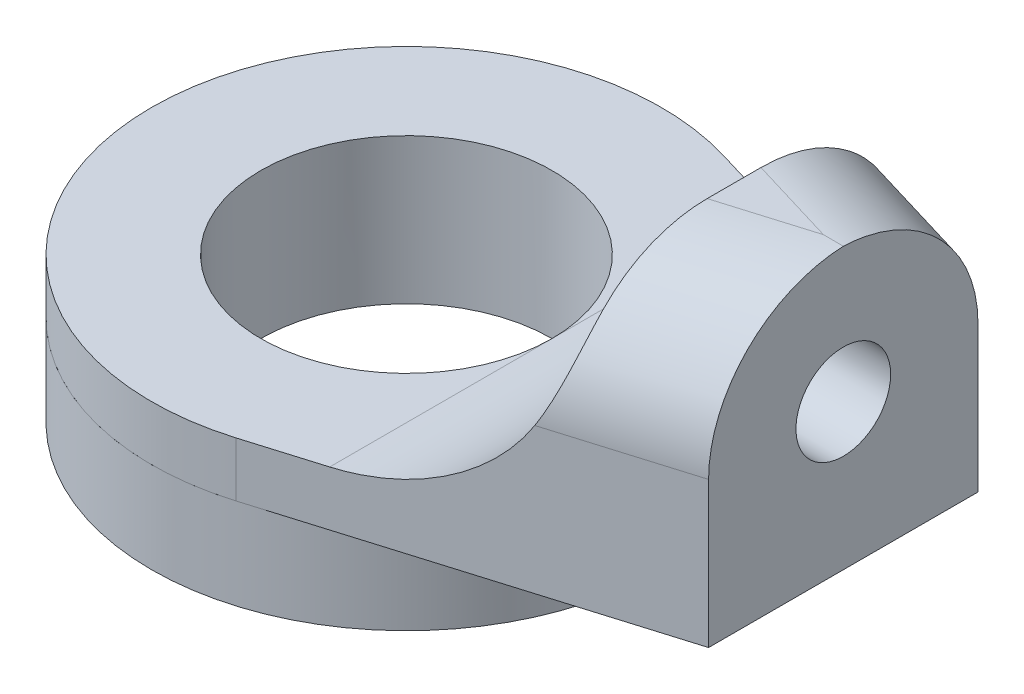
ISO-10303-21;
HEADER;
FILE_DESCRIPTION(('STEP AP214'),'2;1');
FILE_NAME('part.step','',(''),(''),'','','');
FILE_SCHEMA(('AUTOMOTIVE_DESIGN { 1 0 10303 214 1 1 1 1 }'));
ENDSEC;
DATA;
#1=APPLICATION_CONTEXT('core data for automotive mechanical design processes');
#2=APPLICATION_PROTOCOL_DEFINITION('international standard','automotive_design',2000,#1);
#3=PRODUCT_CONTEXT('',#1,'mechanical');
#4=PRODUCT('Part','Part','',(#3));
#5=PRODUCT_RELATED_PRODUCT_CATEGORY('part','',(#4));
#6=PRODUCT_DEFINITION_FORMATION('','',#4);
#7=PRODUCT_DEFINITION_CONTEXT('part definition',#1,'design');
#8=PRODUCT_DEFINITION('design','',#6,#7);
#9=PRODUCT_DEFINITION_SHAPE('','',#8);
#10=(LENGTH_UNIT() NAMED_UNIT(*) SI_UNIT(.MILLI.,.METRE.));
#11=(NAMED_UNIT(*) PLANE_ANGLE_UNIT() SI_UNIT($,.RADIAN.));
#12=(NAMED_UNIT(*) SI_UNIT($,.STERADIAN.) SOLID_ANGLE_UNIT());
#13=UNCERTAINTY_MEASURE_WITH_UNIT(LENGTH_MEASURE(1.E-05),#10,'distance_accuracy_value','');
#14=(GEOMETRIC_REPRESENTATION_CONTEXT(3) GLOBAL_UNCERTAINTY_ASSIGNED_CONTEXT((#13)) GLOBAL_UNIT_ASSIGNED_CONTEXT((#10,
#11,#12)) REPRESENTATION_CONTEXT('',''));
#15=CARTESIAN_POINT('',(0.,0.,0.));
#16=DIRECTION('',(0.,0.,1.));
#17=DIRECTION('',(1.,0.,0.));
#18=AXIS2_PLACEMENT_3D('',#15,#16,#17);
#19=CARTESIAN_POINT('',(0.,1.5,0.));
#20=DIRECTION('',(0.,1.,0.));
#21=DIRECTION('',(0.,0.,1.));
#22=AXIS2_PLACEMENT_3D('',#19,#20,#21);
#23=PLANE('',#22);
#24=DIRECTION('',(-0.957591785777704,0.,0.288128394662984));
#25=VECTOR('',#24,1.);
#26=CARTESIAN_POINT('',(2.01708038245361,1.5,6.70374611204213));
#27=LINE('',#26,#25);
#28=CARTESIAN_POINT('',(4.,1.5,6.10710832270962));
#29=VERTEX_POINT('',#28);
#30=CARTESIAN_POINT('',(2.01708038245361,1.5,6.70374611204213));
#31=VERTEX_POINT('',#30);
#32=EDGE_CURVE('E141',#29,#31,#27,.T.);
#33=ORIENTED_EDGE('',*,*,#32,.F.);
#34=DIRECTION('',(0.,0.,-1.));
#35=VECTOR('',#34,1.);
#36=CARTESIAN_POINT('',(4.,1.5,-4.60266562101611));
#37=LINE('',#36,#35);
#38=CARTESIAN_POINT('',(4.,1.5,0.));
#39=VERTEX_POINT('',#38);
#40=EDGE_CURVE('E159',#29,#39,#37,.T.);
#41=ORIENTED_EDGE('',*,*,#40,.T.);
#42=CARTESIAN_POINT('',(0.,1.5,0.));
#43=DIRECTION('',(0.,1.,0.));
#44=DIRECTION('',(0.,0.,1.));
#45=AXIS2_PLACEMENT_3D('',#42,#43,#44);
#46=CIRCLE('',#45,4.);
#47=EDGE_CURVE('E382',#39,#39,#46,.T.);
#48=ORIENTED_EDGE('',*,*,#47,.F.);
#49=DIRECTION('',(0.,0.,-1.));
#50=VECTOR('',#49,1.);
#51=CARTESIAN_POINT('',(4.,1.5,-4.60266562101611));
#52=LINE('',#51,#50);
#53=CARTESIAN_POINT('',(4.,1.5,-6.10710832270962));
#54=VERTEX_POINT('',#53);
#55=EDGE_CURVE('E157',#39,#54,#52,.T.);
#56=ORIENTED_EDGE('',*,*,#55,.T.);
#57=DIRECTION('',(-0.957591785777704,0.,-0.288128394662984));
#58=VECTOR('',#57,1.);
#59=CARTESIAN_POINT('',(2.01708038245361,1.5,-6.70374611204213));
#60=LINE('',#59,#58);
#61=CARTESIAN_POINT('',(2.01708038245361,1.5,-6.70374611204213));
#62=VERTEX_POINT('',#61);
#63=EDGE_CURVE('E154',#54,#62,#60,.T.);
#64=ORIENTED_EDGE('',*,*,#63,.T.);
#65=CARTESIAN_POINT('',(0.,1.5,0.));
#66=DIRECTION('',(0.,1.,0.));
#67=DIRECTION('',(0.,0.,1.));
#68=AXIS2_PLACEMENT_3D('',#65,#66,#67);
#69=CIRCLE('',#68,7.00063034333332);
#70=EDGE_CURVE('E120',#62,#31,#69,.T.);
#71=ORIENTED_EDGE('',*,*,#70,.T.);
#72=EDGE_LOOP('',(#33,#41,#48,#56,#64,#71));
#73=FACE_BOUND('',#72,.T.);
#74=ADVANCED_FACE('F40',(#73),#23,.T.);
#75=CARTESIAN_POINT('',(0.,0.,0.));
#76=DIRECTION('',(0.,1.,0.));
#77=DIRECTION('',(0.,0.,1.));
#78=AXIS2_PLACEMENT_3D('',#75,#76,#77);
#79=PLANE('',#78);
#80=DIRECTION('',(-0.957591785777704,0.,-0.288128394662984));
#81=VECTOR('',#80,1.);
#82=CARTESIAN_POINT('',(2.01708038245361,0.,-6.70374611204213));
#83=LINE('',#82,#81);
#84=CARTESIAN_POINT('',(12.,0.,-3.7));
#85=VERTEX_POINT('',#84);
#86=CARTESIAN_POINT('',(2.01708038245361,0.,-6.70374611204213));
#87=VERTEX_POINT('',#86);
#88=EDGE_CURVE('E132',#85,#87,#83,.T.);
#89=ORIENTED_EDGE('',*,*,#88,.F.);
#90=DIRECTION('',(0.,0.,-1.));
#91=VECTOR('',#90,1.);
#92=CARTESIAN_POINT('',(12.,0.,0.));
#93=LINE('',#92,#91);
#94=CARTESIAN_POINT('',(12.,0.,3.7));
#95=VERTEX_POINT('',#94);
#96=EDGE_CURVE('E125',#95,#85,#93,.T.);
#97=ORIENTED_EDGE('',*,*,#96,.F.);
#98=DIRECTION('',(-0.957591785777704,0.,0.288128394662984));
#99=VECTOR('',#98,1.);
#100=CARTESIAN_POINT('',(2.01708038245361,0.,6.70374611204213));
#101=LINE('',#100,#99);
#102=CARTESIAN_POINT('',(2.01708038245361,0.,6.70374611204213));
#103=VERTEX_POINT('',#102);
#104=EDGE_CURVE('E135',#95,#103,#101,.T.);
#105=ORIENTED_EDGE('',*,*,#104,.T.);
#106=CARTESIAN_POINT('',(0.,0.,0.));
#107=DIRECTION('',(0.,1.,0.));
#108=DIRECTION('',(0.,0.,1.));
#109=AXIS2_PLACEMENT_3D('',#106,#107,#108);
#110=CIRCLE('',#109,7.00063034333332);
#111=EDGE_CURVE('E118',#87,#103,#110,.T.);
#112=ORIENTED_EDGE('',*,*,#111,.F.);
#113=EDGE_LOOP('',(#89,#97,#105,#112));
#114=FACE_BOUND('',#113,.T.);
#115=CARTESIAN_POINT('',(0.,0.,0.));
#116=DIRECTION('',(0.,1.,0.));
#117=DIRECTION('',(0.,0.,1.));
#118=AXIS2_PLACEMENT_3D('',#115,#116,#117);
#119=CIRCLE('',#118,7.);
#120=CARTESIAN_POINT('',(0.,0.,7.));
#121=VERTEX_POINT('',#120);
#122=EDGE_CURVE('E160',#121,#121,#119,.F.);
#123=ORIENTED_EDGE('',*,*,#122,.F.);
#124=EDGE_LOOP('',(#123));
#125=FACE_BOUND('',#124,.T.);
#126=ADVANCED_FACE('F129',(#114,#125),#79,.F.);
#127=CARTESIAN_POINT('',(0.,0.,0.));
#128=DIRECTION('',(0.,1.,0.));
#129=DIRECTION('',(0.,0.,1.));
#130=AXIS2_PLACEMENT_3D('',#127,#128,#129);
#131=CYLINDRICAL_SURFACE('',#130,4.);
#132=ORIENTED_EDGE('',*,*,#47,.T.);
#133=EDGE_LOOP('',(#132));
#134=FACE_BOUND('',#133,.T.);
#135=CARTESIAN_POINT('',(0.,-2.5,0.));
#136=DIRECTION('',(0.,-1.,0.));
#137=DIRECTION('',(0.,0.,-1.));
#138=AXIS2_PLACEMENT_3D('',#135,#136,#137);
#139=CIRCLE('',#138,4.);
#140=CARTESIAN_POINT('',(0.,-2.5,-4.));
#141=VERTEX_POINT('',#140);
#142=EDGE_CURVE('E396',#141,#141,#139,.T.);
#143=ORIENTED_EDGE('',*,*,#142,.T.);
#144=EDGE_LOOP('',(#143));
#145=FACE_BOUND('',#144,.T.);
#146=ADVANCED_FACE('F217',(#134,#145),#131,.F.);
#147=CARTESIAN_POINT('',(2.01708038245361,0.,-6.70374611204213));
#148=DIRECTION('',(0.288128394662984,0.,-0.957591785777704));
#149=DIRECTION('',(-0.957591785777704,0.,-0.288128394662984));
#150=AXIS2_PLACEMENT_3D('',#147,#148,#149);
#151=PLANE('',#150);
#152=CARTESIAN_POINT('',(4.,6.5,-6.10710832270962));
#153=DIRECTION('',(0.288128394662984,0.,-0.957591785777704));
#154=DIRECTION('',(0.957591785777704,0.,0.288128394662984));
#155=AXIS2_PLACEMENT_3D('',#152,#153,#154);
#156=ELLIPSE('',#155,5.22143158938991,5.);
#157=CARTESIAN_POINT('',(8.3301270189222,4.,-4.80422272450494));
#158=VERTEX_POINT('',#157);
#159=EDGE_CURVE('E166',#54,#158,#156,.F.);
#160=ORIENTED_EDGE('',*,*,#159,.T.);
#161=DIRECTION('',(-0.957591785777704,0.,-0.288128394662984));
#162=VECTOR('',#161,1.);
#163=CARTESIAN_POINT('',(2.01708038245361,4.,-6.70374611204213));
#164=LINE('',#163,#162);
#165=CARTESIAN_POINT('',(12.,4.,-3.7));
#166=VERTEX_POINT('',#165);
#167=EDGE_CURVE('E371',#158,#166,#164,.F.);
#168=ORIENTED_EDGE('',*,*,#167,.T.);
#169=DIRECTION('',(0.,1.,0.));
#170=VECTOR('',#169,1.);
#171=CARTESIAN_POINT('',(12.,0.,-3.7));
#172=LINE('',#171,#170);
#173=EDGE_CURVE('E140',#85,#166,#172,.T.);
#174=ORIENTED_EDGE('',*,*,#173,.F.);
#175=ORIENTED_EDGE('',*,*,#88,.T.);
#176=DIRECTION('',(0.,1.,0.));
#177=VECTOR('',#176,1.);
#178=CARTESIAN_POINT('',(2.01708038245361,0.,-6.70374611204213));
#179=LINE('',#178,#177);
#180=EDGE_CURVE('E114',#87,#62,#179,.T.);
#181=ORIENTED_EDGE('',*,*,#180,.T.);
#182=ORIENTED_EDGE('',*,*,#63,.F.);
#183=EDGE_LOOP('',(#160,#168,#174,#175,#181,#182));
#184=FACE_BOUND('',#183,.T.);
#185=ADVANCED_FACE('F139',(#184),#151,.T.);
#186=CARTESIAN_POINT('',(12.,0.,0.));
#187=DIRECTION('',(1.,0.,0.));
#188=DIRECTION('',(0.,0.,-1.));
#189=AXIS2_PLACEMENT_3D('',#186,#187,#188);
#190=PLANE('',#189);
#191=CARTESIAN_POINT('',(12.,4.,0.));
#192=DIRECTION('',(1.,0.,0.));
#193=DIRECTION('',(0.,0.,-1.));
#194=AXIS2_PLACEMENT_3D('',#191,#192,#193);
#195=CIRCLE('',#194,1.3);
#196=CARTESIAN_POINT('',(12.,4.,-1.3));
#197=VERTEX_POINT('',#196);
#198=EDGE_CURVE('E179',#197,#197,#195,.T.);
#199=ORIENTED_EDGE('',*,*,#198,.F.);
#200=EDGE_LOOP('',(#199));
#201=FACE_BOUND('',#200,.T.);
#202=ORIENTED_EDGE('',*,*,#173,.T.);
#203=CARTESIAN_POINT('',(12.,4.,0.163859376148534));
#204=DIRECTION('',(1.,0.,0.));
#205=DIRECTION('',(0.,0.,-1.));
#206=AXIS2_PLACEMENT_3D('',#203,#204,#205);
#207=ELLIPSE('',#206,3.86385937614854,3.7);
#208=CARTESIAN_POINT('',(12.,7.69667135794989,0.));
#209=VERTEX_POINT('',#208);
#210=EDGE_CURVE('E50',#166,#209,#207,.T.);
#211=ORIENTED_EDGE('',*,*,#210,.T.);
#212=CARTESIAN_POINT('',(12.,4.,-0.163859376148534));
#213=DIRECTION('',(1.,0.,0.));
#214=DIRECTION('',(0.,0.,1.));
#215=AXIS2_PLACEMENT_3D('',#212,#213,#214);
#216=ELLIPSE('',#215,3.86385937614854,3.7);
#217=CARTESIAN_POINT('',(12.,4.,3.7));
#218=VERTEX_POINT('',#217);
#219=EDGE_CURVE('E60',#209,#218,#216,.T.);
#220=ORIENTED_EDGE('',*,*,#219,.T.);
#221=DIRECTION('',(0.,1.,0.));
#222=VECTOR('',#221,1.);
#223=CARTESIAN_POINT('',(12.,0.,3.7));
#224=LINE('',#223,#222);
#225=EDGE_CURVE('E383',#95,#218,#224,.T.);
#226=ORIENTED_EDGE('',*,*,#225,.F.);
#227=ORIENTED_EDGE('',*,*,#96,.T.);
#228=EDGE_LOOP('',(#202,#211,#220,#226,#227));
#229=FACE_BOUND('',#228,.T.);
#230=ADVANCED_FACE('F205',(#201,#229),#190,.T.);
#231=CARTESIAN_POINT('',(2.01708038245361,0.,6.70374611204213));
#232=DIRECTION('',(-0.288128394662984,0.,-0.957591785777704));
#233=DIRECTION('',(-0.957591785777704,0.,0.288128394662984));
#234=AXIS2_PLACEMENT_3D('',#231,#232,#233);
#235=PLANE('',#234);
#236=ORIENTED_EDGE('',*,*,#225,.T.);
#237=DIRECTION('',(0.957591785777704,0.,-0.288128394662984));
#238=VECTOR('',#237,1.);
#239=CARTESIAN_POINT('',(9.,4.,4.60266562101611));
#240=LINE('',#239,#238);
#241=CARTESIAN_POINT('',(8.3301270189222,4.,4.80422272450494));
#242=VERTEX_POINT('',#241);
#243=EDGE_CURVE('E12',#218,#242,#240,.F.);
#244=ORIENTED_EDGE('',*,*,#243,.T.);
#245=CARTESIAN_POINT('',(4.,6.5,6.10710832270962));
#246=DIRECTION('',(-0.288128394662984,0.,-0.957591785777704));
#247=DIRECTION('',(-0.957591785777704,0.,0.288128394662984));
#248=AXIS2_PLACEMENT_3D('',#245,#246,#247);
#249=ELLIPSE('',#248,5.22143158938991,5.);
#250=EDGE_CURVE('E168',#242,#29,#249,.T.);
#251=ORIENTED_EDGE('',*,*,#250,.T.);
#252=ORIENTED_EDGE('',*,*,#32,.T.);
#253=DIRECTION('',(0.,1.,0.));
#254=VECTOR('',#253,1.);
#255=CARTESIAN_POINT('',(2.01708038245361,0.,6.70374611204213));
#256=LINE('',#255,#254);
#257=EDGE_CURVE('E124',#103,#31,#256,.T.);
#258=ORIENTED_EDGE('',*,*,#257,.F.);
#259=ORIENTED_EDGE('',*,*,#104,.F.);
#260=EDGE_LOOP('',(#236,#244,#251,#252,#258,#259));
#261=FACE_BOUND('',#260,.T.);
#262=ADVANCED_FACE('F208',(#261),#235,.F.);
#263=CARTESIAN_POINT('',(0.,0.,0.));
#264=DIRECTION('',(0.,1.,0.));
#265=DIRECTION('',(0.,0.,1.));
#266=AXIS2_PLACEMENT_3D('',#263,#264,#265);
#267=CYLINDRICAL_SURFACE('',#266,7.00063034333332);
#268=ORIENTED_EDGE('',*,*,#70,.F.);
#269=ORIENTED_EDGE('',*,*,#180,.F.);
#270=ORIENTED_EDGE('',*,*,#111,.T.);
#271=ORIENTED_EDGE('',*,*,#257,.T.);
#272=EDGE_LOOP('',(#268,#269,#270,#271));
#273=FACE_BOUND('',#272,.T.);
#274=ADVANCED_FACE('F116',(#273),#267,.T.);
#275=CARTESIAN_POINT('',(0.,-2.5,0.));
#276=DIRECTION('',(0.,-1.,0.));
#277=DIRECTION('',(0.,0.,-1.));
#278=AXIS2_PLACEMENT_3D('',#275,#276,#277);
#279=PLANE('',#278);
#280=CARTESIAN_POINT('',(0.,-2.5,0.));
#281=DIRECTION('',(0.,-1.,0.));
#282=DIRECTION('',(0.,0.,-1.));
#283=AXIS2_PLACEMENT_3D('',#280,#281,#282);
#284=CIRCLE('',#283,7.);
#285=CARTESIAN_POINT('',(0.,-2.5,-7.));
#286=VERTEX_POINT('',#285);
#287=EDGE_CURVE('E145',#286,#286,#284,.T.);
#288=ORIENTED_EDGE('',*,*,#287,.T.);
#289=EDGE_LOOP('',(#288));
#290=FACE_BOUND('',#289,.T.);
#291=ORIENTED_EDGE('',*,*,#142,.F.);
#292=EDGE_LOOP('',(#291));
#293=FACE_BOUND('',#292,.T.);
#294=ADVANCED_FACE('F198',(#290,#293),#279,.T.);
#295=CARTESIAN_POINT('',(0.,-2.5,0.));
#296=DIRECTION('',(0.,1.,0.));
#297=DIRECTION('',(0.,0.,1.));
#298=AXIS2_PLACEMENT_3D('',#295,#296,#297);
#299=CYLINDRICAL_SURFACE('',#298,7.);
#300=ORIENTED_EDGE('',*,*,#287,.F.);
#301=EDGE_LOOP('',(#300));
#302=FACE_BOUND('',#301,.T.);
#303=ORIENTED_EDGE('',*,*,#122,.T.);
#304=EDGE_LOOP('',(#303));
#305=FACE_BOUND('',#304,.T.);
#306=ADVANCED_FACE('F196',(#302,#305),#299,.T.);
#307=CARTESIAN_POINT('',(9.,7.7,0.));
#308=DIRECTION('',(-1.,0.,0.));
#309=DIRECTION('',(0.,0.,1.));
#310=AXIS2_PLACEMENT_3D('',#307,#308,#309);
#311=PLANE('',#310);
#312=DIRECTION('',(0.,0.,-1.));
#313=VECTOR('',#312,1.);
#314=CARTESIAN_POINT('',(9.,7.7,0.));
#315=LINE('',#314,#313);
#316=CARTESIAN_POINT('',(9.,7.7,0.738806244867572));
#317=VERTEX_POINT('',#316);
#318=CARTESIAN_POINT('',(9.,7.7,-0.738806244867572));
#319=VERTEX_POINT('',#318);
#320=EDGE_CURVE('E178',#317,#319,#315,.T.);
#321=ORIENTED_EDGE('',*,*,#320,.T.);
#322=CARTESIAN_POINT('',(9.,4.,-0.738806244867572));
#323=DIRECTION('',(-1.,0.,0.));
#324=DIRECTION('',(0.,0.,-1.));
#325=AXIS2_PLACEMENT_3D('',#322,#323,#324);
#326=ELLIPSE('',#325,3.86385937614854,3.7);
#327=CARTESIAN_POINT('',(9.,6.5,-3.58723955424682));
#328=VERTEX_POINT('',#327);
#329=EDGE_CURVE('E418',#319,#328,#326,.T.);
#330=ORIENTED_EDGE('',*,*,#329,.T.);
#331=DIRECTION('',(0.,0.,-1.));
#332=VECTOR('',#331,1.);
#333=CARTESIAN_POINT('',(9.,6.5,4.60266562101611));
#334=LINE('',#333,#332);
#335=CARTESIAN_POINT('',(9.,6.5,3.58723955424682));
#336=VERTEX_POINT('',#335);
#337=EDGE_CURVE('E163',#328,#336,#334,.F.);
#338=ORIENTED_EDGE('',*,*,#337,.T.);
#339=CARTESIAN_POINT('',(9.,4.,0.738806244867572));
#340=DIRECTION('',(-1.,0.,0.));
#341=DIRECTION('',(0.,0.,1.));
#342=AXIS2_PLACEMENT_3D('',#339,#340,#341);
#343=ELLIPSE('',#342,3.86385937614854,3.7);
#344=EDGE_CURVE('E415',#336,#317,#343,.T.);
#345=ORIENTED_EDGE('',*,*,#344,.T.);
#346=EDGE_LOOP('',(#321,#330,#338,#345));
#347=FACE_BOUND('',#346,.T.);
#348=ADVANCED_FACE('F192',(#347),#311,.T.);
#349=CARTESIAN_POINT('',(0.,7.7,0.));
#350=DIRECTION('',(0.,1.,0.));
#351=DIRECTION('',(0.,0.,1.));
#352=AXIS2_PLACEMENT_3D('',#349,#350,#351);
#353=PLANE('',#352);
#354=DIRECTION('',(0.957591785777704,0.,-0.288128394662984));
#355=VECTOR('',#354,1.);
#356=CARTESIAN_POINT('',(10.933924939747,7.7,0.156910392622497));
#357=LINE('',#356,#355);
#358=CARTESIAN_POINT('',(11.4554150318783,7.7,0.));
#359=VERTEX_POINT('',#358);
#360=EDGE_CURVE('E170',#317,#359,#357,.T.);
#361=ORIENTED_EDGE('',*,*,#360,.T.);
#362=DIRECTION('',(-0.957591785777704,0.,-0.288128394662984));
#363=VECTOR('',#362,1.);
#364=CARTESIAN_POINT('',(0.951005322200564,7.7,-3.16065650466463));
#365=LINE('',#364,#363);
#366=EDGE_CURVE('E389',#359,#319,#365,.T.);
#367=ORIENTED_EDGE('',*,*,#366,.T.);
#368=ORIENTED_EDGE('',*,*,#320,.F.);
#369=EDGE_LOOP('',(#361,#367,#368));
#370=FACE_BOUND('',#369,.T.);
#371=ADVANCED_FACE('F189',(#370),#353,.T.);
#372=CARTESIAN_POINT('',(4.,6.5,0.));
#373=DIRECTION('',(0.,0.,1.));
#374=DIRECTION('',(1.,0.,0.));
#375=AXIS2_PLACEMENT_3D('',#372,#373,#374);
#376=CYLINDRICAL_SURFACE('',#375,5.);
#377=CARTESIAN_POINT('',(8.33012701892219,4.,-1.3));
#378=CARTESIAN_POINT('',(8.37177667400756,4.07214447571825,-1.29999758388623));
#379=CARTESIAN_POINT('',(8.41165369318559,4.14540875924071,-1.29398320423444));
#380=CARTESIAN_POINT('',(8.48689133716507,4.2921471199452,-1.26893405188312));
#381=CARTESIAN_POINT('',(8.52224782182033,4.36562132732272,-1.24988744352968));
#382=CARTESIAN_POINT('',(8.58784297537612,4.51051570505641,-1.19804719253232));
#383=CARTESIAN_POINT('',(8.61805553927449,4.58192395568619,-1.1651862031393));
#384=CARTESIAN_POINT('',(8.67269654693066,4.71916732875826,-1.08584944446777));
#385=CARTESIAN_POINT('',(8.69712899315507,4.78500628726482,-1.03938314642666));
#386=CARTESIAN_POINT('',(8.73818622161789,4.90216094977396,-0.938879593689701));
#387=CARTESIAN_POINT('',(8.75532905231005,4.95426009542836,-0.88596465176061));
#388=CARTESIAN_POINT('',(8.78513167589454,5.0491403137931,-0.77125796540418));
#389=CARTESIAN_POINT('',(8.79779257034756,5.09192367512062,-0.709468407416466));
#390=CARTESIAN_POINT('',(8.81845665469738,5.16440097635606,-0.582435194701794));
#391=CARTESIAN_POINT('',(8.82667386923744,5.19467551558383,-0.517556481300735));
#392=CARTESIAN_POINT('',(8.83980349954157,5.24422798384649,-0.383415061437942));
#393=CARTESIAN_POINT('',(8.8447162565179,5.26350704822281,-0.314152808420833));
#394=CARTESIAN_POINT('',(8.85146206747728,5.2902456437744,-0.174055971315255));
#395=CARTESIAN_POINT('',(8.85332929333997,5.29783626835458,-0.103247997127972));
#396=CARTESIAN_POINT('',(8.85420128529218,5.30136176745106,0.0386757843053676));
#397=CARTESIAN_POINT('',(8.85320606726308,5.29729670663534,0.109791589841331));
#398=CARTESIAN_POINT('',(8.84829450050907,5.27764932800009,0.250281902033405));
#399=CARTESIAN_POINT('',(8.84437930720417,5.26207156572266,0.319657086224566));
#400=CARTESIAN_POINT('',(8.83341422955757,5.21993076397511,0.454722946718908));
#401=CARTESIAN_POINT('',(8.82636445844578,5.1933681213127,0.520413756015726));
#402=CARTESIAN_POINT('',(8.80881100430541,5.13018016005145,0.6462581705291));
#403=CARTESIAN_POINT('',(8.79830738098557,5.09355501541065,0.706411871445822));
#404=CARTESIAN_POINT('',(8.77350617815004,5.01155548739358,0.819533661987102));
#405=CARTESIAN_POINT('',(8.75920880389419,4.96618157740311,0.872502140131903));
#406=CARTESIAN_POINT('',(8.72645362032377,4.86803125564485,0.970230467180116));
#407=CARTESIAN_POINT('',(8.70797086830684,4.81521121194745,1.01493805905705));
#408=CARTESIAN_POINT('',(8.66679076722407,4.70429395495004,1.09482592034434));
#409=CARTESIAN_POINT('',(8.64409308343207,4.64619632272098,1.13000543254238));
#410=CARTESIAN_POINT('',(8.5937416762418,4.524650578789,1.19144299552511));
#411=CARTESIAN_POINT('',(8.56594509639488,4.46108747124382,1.21735509103923));
#412=CARTESIAN_POINT('',(8.50630669912088,4.33245946669322,1.25858579324376));
#413=CARTESIAN_POINT('',(8.47446347438638,4.26739405370169,1.27390070253631));
#414=CARTESIAN_POINT('',(8.40430244514262,4.13178469465912,1.29528007541578));
#415=CARTESIAN_POINT('',(8.36566145859018,4.06126259324721,1.30041172316953));
#416=CARTESIAN_POINT('',(8.28505330319948,3.92225117430928,1.29953600920746));
#417=CARTESIAN_POINT('',(8.24308495158744,3.85376259163387,1.29352466936183));
#418=CARTESIAN_POINT('',(8.15059400326212,3.71058855758604,1.26973547249187));
#419=CARTESIAN_POINT('',(8.09970182136674,3.63639968374589,1.25041138257861));
#420=CARTESIAN_POINT('',(7.99611637241917,3.49352980372975,1.1996860289583));
#421=CARTESIAN_POINT('',(7.943420834156,3.424856137186,1.16826898362175));
#422=CARTESIAN_POINT('',(7.8301423674346,3.28452694229854,1.08881529861399));
#423=CARTESIAN_POINT('',(7.76952488709108,3.21388564540168,1.03902814886491));
#424=CARTESIAN_POINT('',(7.65090437083923,3.08259067692951,0.925152871194965));
#425=CARTESIAN_POINT('',(7.59289875673135,3.02192699210022,0.861079234851558));
#426=CARTESIAN_POINT('',(7.50230419753125,2.93117663574861,0.742398496904665));
#427=CARTESIAN_POINT('',(7.46774414748909,2.89768005833545,0.691894381984074));
#428=CARTESIAN_POINT('',(7.40365481512568,2.83706864873556,0.584286099150017));
#429=CARTESIAN_POINT('',(7.37411624547325,2.80994199899157,0.527194450841818));
#430=CARTESIAN_POINT('',(7.32847555161473,2.7687832300328,0.420244860289173));
#431=CARTESIAN_POINT('',(7.31084558027409,2.75317788875066,0.371654622239265));
#432=CARTESIAN_POINT('',(7.28163442865772,2.72756634185567,0.271268689974706));
#433=CARTESIAN_POINT('',(7.27004663090755,2.71755400983848,0.219476572364531));
#434=CARTESIAN_POINT('',(7.25413752408882,2.70385633094655,0.11350309475449));
#435=CARTESIAN_POINT('',(7.24987362395565,2.70022096575022,0.059306244320382));
#436=CARTESIAN_POINT('',(7.24938030281691,2.69979887670687,-0.0491484380188852));
#437=CARTESIAN_POINT('',(7.25314949090393,2.7030109672415,-0.10340625774157));
#438=CARTESIAN_POINT('',(7.2673262503615,2.71520827615315,-0.203910674569537));
#439=CARTESIAN_POINT('',(7.27692613470647,2.72349194168801,-0.250364292560229));
#440=CARTESIAN_POINT('',(7.30111676603231,2.74461907901129,-0.34085326448729));
#441=CARTESIAN_POINT('',(7.31571024323851,2.75746504536395,-0.384887280199061));
#442=CARTESIAN_POINT('',(7.35688320855384,2.79427309708029,-0.490606436535522));
#443=CARTESIAN_POINT('',(7.38584658430684,2.82060691919749,-0.550534327740143));
#444=CARTESIAN_POINT('',(7.44952238661654,2.8802334660629,-0.663494155518644));
#445=CARTESIAN_POINT('',(7.48424979782773,2.91354438977459,-0.716507457468976));
#446=CARTESIAN_POINT('',(7.57162347771982,3.00019792110081,-0.835303581238012));
#447=CARTESIAN_POINT('',(7.62593482192478,3.05625931652737,-0.897875718153227));
#448=CARTESIAN_POINT('',(7.73743835830109,3.17759440292486,-1.0101932854641));
#449=CARTESIAN_POINT('',(7.79463420332461,3.24287997360062,-1.05992193759439));
#450=CARTESIAN_POINT('',(7.91045311663038,3.38282532552776,-1.14718403283284));
#451=CARTESIAN_POINT('',(7.96908136790328,3.45765012216995,-1.18444597956828));
#452=CARTESIAN_POINT('',(8.08429881586988,3.61419098568437,-1.2442411588924));
#453=CARTESIAN_POINT('',(8.14089335347227,3.69588677972536,-1.26681611514101));
#454=CARTESIAN_POINT('',(8.21873826236617,3.81595754659012,-1.28741948014036));
#455=CARTESIAN_POINT('',(8.24160109618729,3.85223325350696,-1.29209836279599));
#456=CARTESIAN_POINT('',(8.28651036242565,3.92557228924177,-1.29838993571871));
#457=CARTESIAN_POINT('',(8.30855642448638,3.96263596365173,-1.30000125131913));
#458=CARTESIAN_POINT('',(8.33012701892219,4.,-1.3));
#459=B_SPLINE_CURVE_WITH_KNOTS('',3,(#377,#378,#379,#380,#381,#382,#383,#384,#385,#386,#387,
#388,#389,#390,#391,#392,#393,#394,#395,#396,#397,#398,#399,#400,#401,#402,#403,#404,#405,#406,
#407,#408,#409,#410,#411,#412,#413,#414,#415,#416,#417,#418,#419,#420,#421,#422,#423,#424,#425,
#426,#427,#428,#429,#430,#431,#432,#433,#434,#435,#436,#437,#438,#439,#440,#441,#442,#443,#444,
#445,#446,#447,#448,#449,#450,#451,#452,#453,#454,#455,#456,#457,#458),.UNSPECIFIED.,.T.,.F.,(4,
2,2,2,2,2,2,2,2,2,2,2,2,2,2,2,2,2,2,2,2,2,2,2,2,2,2,2,2,2,2,2,2,2,2,2,2,2,2,2,4),(0.,
0.249768581503576,0.499764300297723,0.750993176406249,1.00204757547767,1.22950183519577,
1.45690015281582,1.67205848263546,1.88719459218584,2.09989976908563,2.31260376585848,
2.52522364131895,2.73783583696547,2.95044435725597,3.16304137676614,3.37694036164783,
3.59085634045259,3.8120824652588,4.03338573781909,4.27416699498048,4.51503422940536,
4.79002321798456,5.06537229794877,5.38069147990104,5.69569225950709,5.90438442986108,
6.11268631824181,6.27406363838567,6.43526384257994,6.59772195647479,6.76015194347376,
6.90402317199477,7.04797318750921,7.26150939098274,7.47560967435412,7.77415621219055,
8.07309080996126,8.37816608450002,8.68237085452423,8.81166950166349,8.94102607768743),.UNSPECIFIED.);
#460=CARTESIAN_POINT('',(8.33012701892219,4.,-1.3));
#461=VERTEX_POINT('',#460);
#462=EDGE_CURVE('E171',#461,#461,#459,.T.);
#463=ORIENTED_EDGE('',*,*,#462,.T.);
#464=EDGE_LOOP('',(#463));
#465=FACE_BOUND('',#464,.T.);
#466=ORIENTED_EDGE('',*,*,#337,.F.);
#467=CARTESIAN_POINT('',(9.,6.5,-3.58723955424682));
#468=CARTESIAN_POINT('',(9.00001360762172,6.4240901872563,-3.65992187502882));
#469=CARTESIAN_POINT('',(8.99827193880928,6.34536871450356,-3.72967256170409));
#470=CARTESIAN_POINT('',(8.99060488437839,6.18310203261705,-3.86307918157707));
#471=CARTESIAN_POINT('',(8.98467914795918,6.09955641955686,-3.92673460322712));
#472=CARTESIAN_POINT('',(8.96798187005258,5.92856979558378,-4.04762509898442));
#473=CARTESIAN_POINT('',(8.95721689597484,5.84113420824263,-4.10486874353491));
#474=CARTESIAN_POINT('',(8.93029476980004,5.66316760575586,-4.21289151064965));
#475=CARTESIAN_POINT('',(8.91413822201669,5.57263693854202,-4.26367135682694));
#476=CARTESIAN_POINT('',(8.8759623929426,5.38924383585132,-4.35881116836057));
#477=CARTESIAN_POINT('',(8.85393237971014,5.29637741669298,-4.40315915011343));
#478=CARTESIAN_POINT('',(8.80372033755116,5.10944757118555,-4.485377525111));
#479=CARTESIAN_POINT('',(8.77553823717695,5.01538413094672,-4.52324784311781));
#480=CARTESIAN_POINT('',(8.71290344592236,4.82716841223327,-4.59262196500582));
#481=CARTESIAN_POINT('',(8.67845962263223,4.73301644435887,-4.62413464083573));
#482=CARTESIAN_POINT('',(8.60325520211431,4.54545565489406,-4.68111720197297));
#483=CARTESIAN_POINT('',(8.56249732580123,4.45204653133335,-4.70658967827365));
#484=CARTESIAN_POINT('',(8.489836952965,4.29866165722293,-4.74408788658454));
#485=CARTESIAN_POINT('',(8.45970540167286,4.23822896445489,-4.75772624620238));
#486=CARTESIAN_POINT('',(8.39685253514018,4.11834756758646,-4.78267692987021));
#487=CARTESIAN_POINT('',(8.364134913261,4.05889760172006,-4.7939924910252));
#488=CARTESIAN_POINT('',(8.33012701892223,3.99999999999999,-4.80422272450496));
#489=B_SPLINE_CURVE_WITH_KNOTS('',3,(#467,#468,#469,#470,#471,#472,#473,#474,#475,#476,#477,
#478,#479,#480,#481,#482,#483,#484,#485,#486,#487,#488),.UNSPECIFIED.,.F.,.F.,(4,2,2,2,2,2,2,2,
2,2,4),(0.,0.315200117786026,0.630426665730704,0.945226699987487,1.25999146177621,
1.57533534796833,1.89068289662346,2.20558729365095,2.52035636449074,2.72694219738538,
2.93323814313239),.UNSPECIFIED.);
#490=EDGE_CURVE('E365',#328,#158,#489,.T.);
#491=ORIENTED_EDGE('',*,*,#490,.T.);
#492=ORIENTED_EDGE('',*,*,#159,.F.);
#493=ORIENTED_EDGE('',*,*,#55,.F.);
#494=ORIENTED_EDGE('',*,*,#40,.F.);
#495=ORIENTED_EDGE('',*,*,#250,.F.);
#496=CARTESIAN_POINT('',(8.3301270189222,4.,4.80422272450494));
#497=CARTESIAN_POINT('',(8.3827849705737,4.09115981869379,4.78839948389108));
#498=CARTESIAN_POINT('',(8.43233610485635,4.18367922904717,4.7699511768998));
#499=CARTESIAN_POINT('',(8.52509738947953,4.37060540017509,4.72736767059521));
#500=CARTESIAN_POINT('',(8.56830548132172,4.4650127623999,4.70323063171805));
#501=CARTESIAN_POINT('',(8.64822176889524,4.65482932223511,4.64884073757346));
#502=CARTESIAN_POINT('',(8.68492952114693,4.75023858772941,4.61858746533301));
#503=CARTESIAN_POINT('',(8.75183738782331,4.94107129250294,4.55166848173604));
#504=CARTESIAN_POINT('',(8.78203869646127,5.03649472595881,4.51500394936446));
#505=CARTESIAN_POINT('',(8.83615340941154,5.22664928466179,4.43494338222447));
#506=CARTESIAN_POINT('',(8.86004813923031,5.32137756385981,4.39152794732364));
#507=CARTESIAN_POINT('',(8.9017146505847,5.50883276049345,4.29796078920462));
#508=CARTESIAN_POINT('',(8.91948647638184,5.60155969239196,4.2478091146853));
#509=CARTESIAN_POINT('',(8.94930180089254,5.78381404531657,4.14091318204524));
#510=CARTESIAN_POINT('',(8.96135734317881,5.87334782232258,4.08418310079701));
#511=CARTESIAN_POINT('',(8.98034583313894,6.04844164247405,3.96419491896629));
#512=CARTESIAN_POINT('',(8.98728142764167,6.1340037173767,3.90094021068539));
#513=CARTESIAN_POINT('',(8.9947664483247,6.26608877059187,3.79544635253557));
#514=CARTESIAN_POINT('',(8.99676926145265,6.31419260548816,3.75526572508614));
#515=CARTESIAN_POINT('',(8.99938571737051,6.40852479648504,3.67281487813246));
#516=CARTESIAN_POINT('',(9.00000082186363,6.45475507557128,3.6305469052915));
#517=CARTESIAN_POINT('',(9.,6.5,3.58723955424682));
#518=B_SPLINE_CURVE_WITH_KNOTS('',3,(#496,#497,#498,#499,#500,#501,#502,#503,#504,#505,#506,
#507,#508,#509,#510,#511,#512,#513,#514,#515,#516,#517),.UNSPECIFIED.,.F.,.F.,(4,2,2,2,2,2,2,2,
2,2,4),(0.,0.319316535766,0.638736470860874,0.958178189696103,1.27756122713942,1.59787964479446,
1.91819574686887,2.2378339464544,2.55730678864666,2.74536429528177,2.93322362425126),.UNSPECIFIED.);
#519=EDGE_CURVE('E372',#242,#336,#518,.T.);
#520=ORIENTED_EDGE('',*,*,#519,.T.);
#521=EDGE_LOOP('',(#466,#491,#492,#493,#494,#495,#520));
#522=FACE_BOUND('',#521,.T.);
#523=ADVANCED_FACE('F181',(#465,#522),#376,.F.);
#524=CARTESIAN_POINT('',(-7.00063034333332,4.,0.));
#525=DIRECTION('',(1.,0.,0.));
#526=DIRECTION('',(0.,0.,-1.));
#527=AXIS2_PLACEMENT_3D('',#524,#525,#526);
#528=CYLINDRICAL_SURFACE('',#527,1.3);
#529=ORIENTED_EDGE('',*,*,#198,.T.);
#530=EDGE_LOOP('',(#529));
#531=FACE_BOUND('',#530,.T.);
#532=ORIENTED_EDGE('',*,*,#462,.F.);
#533=EDGE_LOOP('',(#532));
#534=FACE_BOUND('',#533,.T.);
#535=ADVANCED_FACE('F184',(#531,#534),#528,.F.);
#536=CARTESIAN_POINT('',(0.951005322200564,4.,3.16065650466463));
#537=DIRECTION('',(-0.957591785777704,0.,0.288128394662984));
#538=DIRECTION('',(0.288128394662984,0.,0.957591785777704));
#539=AXIS2_PLACEMENT_3D('',#536,#537,#538);
#540=CYLINDRICAL_SURFACE('',#539,3.7);
#541=ORIENTED_EDGE('',*,*,#243,.F.);
#542=ORIENTED_EDGE('',*,*,#219,.F.);
#543=CARTESIAN_POINT('',(11.4554150318783,4.,0.));
#544=DIRECTION('',(0.,0.,-1.));
#545=DIRECTION('',(-1.,0.,0.));
#546=AXIS2_PLACEMENT_3D('',#543,#544,#545);
#547=ELLIPSE('',#546,12.841497292649,3.7);
#548=EDGE_CURVE('E45',#359,#209,#547,.T.);
#549=ORIENTED_EDGE('',*,*,#548,.F.);
#550=ORIENTED_EDGE('',*,*,#360,.F.);
#551=ORIENTED_EDGE('',*,*,#344,.F.);
#552=ORIENTED_EDGE('',*,*,#519,.F.);
#553=EDGE_LOOP('',(#541,#542,#549,#550,#551,#552));
#554=FACE_BOUND('',#553,.T.);
#555=ADVANCED_FACE('F42',(#554),#540,.T.);
#556=CARTESIAN_POINT('',(0.951005322200564,4.,-3.16065650466463));
#557=DIRECTION('',(-0.957591785777704,0.,-0.288128394662984));
#558=DIRECTION('',(-0.288128394662984,0.,0.957591785777704));
#559=AXIS2_PLACEMENT_3D('',#556,#557,#558);
#560=CYLINDRICAL_SURFACE('',#559,3.7);
#561=ORIENTED_EDGE('',*,*,#210,.F.);
#562=ORIENTED_EDGE('',*,*,#167,.F.);
#563=ORIENTED_EDGE('',*,*,#490,.F.);
#564=ORIENTED_EDGE('',*,*,#329,.F.);
#565=ORIENTED_EDGE('',*,*,#366,.F.);
#566=ORIENTED_EDGE('',*,*,#548,.T.);
#567=EDGE_LOOP('',(#561,#562,#563,#564,#565,#566));
#568=FACE_BOUND('',#567,.T.);
#569=ADVANCED_FACE('F280',(#568),#560,.T.);
#570=CLOSED_SHELL('',(#74,#126,#146,#185,#230,#262,#274,#294,#306,#348,#371,#523,#535,#555,#569));
#571=MANIFOLD_SOLID_BREP('B2',#570);
#572=ADVANCED_BREP_SHAPE_REPRESENTATION('',(#18,#571),#14);
#573=SHAPE_DEFINITION_REPRESENTATION(#9,#572);
ENDSEC;
END-ISO-10303-21;
